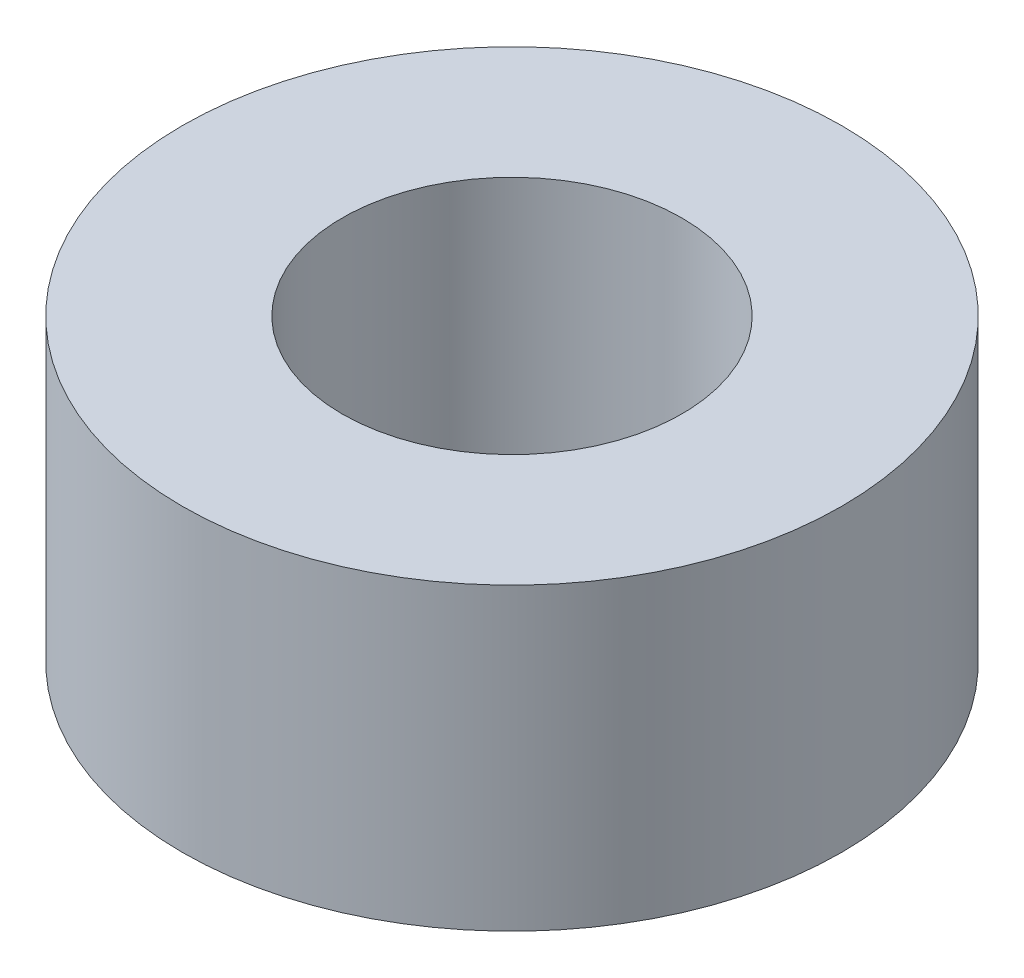
ISO-10303-21;
HEADER;
FILE_DESCRIPTION(('STEP AP214'),'2;1');
FILE_NAME('part.step','',(''),(''),'','','');
FILE_SCHEMA(('AUTOMOTIVE_DESIGN { 1 0 10303 214 1 1 1 1 }'));
ENDSEC;
DATA;
#1=APPLICATION_CONTEXT('core data for automotive mechanical design processes');
#2=APPLICATION_PROTOCOL_DEFINITION('international standard','automotive_design',2000,#1);
#3=PRODUCT_CONTEXT('',#1,'mechanical');
#4=PRODUCT('Part','Part','',(#3));
#5=PRODUCT_RELATED_PRODUCT_CATEGORY('part','',(#4));
#6=PRODUCT_DEFINITION_FORMATION('','',#4);
#7=PRODUCT_DEFINITION_CONTEXT('part definition',#1,'design');
#8=PRODUCT_DEFINITION('design','',#6,#7);
#9=PRODUCT_DEFINITION_SHAPE('','',#8);
#10=(LENGTH_UNIT() NAMED_UNIT(*) SI_UNIT(.MILLI.,.METRE.));
#11=(NAMED_UNIT(*) PLANE_ANGLE_UNIT() SI_UNIT($,.RADIAN.));
#12=(NAMED_UNIT(*) SI_UNIT($,.STERADIAN.) SOLID_ANGLE_UNIT());
#13=UNCERTAINTY_MEASURE_WITH_UNIT(LENGTH_MEASURE(1.E-05),#10,'distance_accuracy_value','');
#14=(GEOMETRIC_REPRESENTATION_CONTEXT(3) GLOBAL_UNCERTAINTY_ASSIGNED_CONTEXT((#13)) GLOBAL_UNIT_ASSIGNED_CONTEXT((#10,
#11,#12)) REPRESENTATION_CONTEXT('',''));
#15=CARTESIAN_POINT('',(0.,0.,0.));
#16=DIRECTION('',(0.,0.,1.));
#17=DIRECTION('',(1.,0.,0.));
#18=AXIS2_PLACEMENT_3D('',#15,#16,#17);
#19=CARTESIAN_POINT('',(0.,3.,0.));
#20=DIRECTION('',(0.,-1.,0.));
#21=DIRECTION('',(0.,0.,-1.));
#22=AXIS2_PLACEMENT_3D('',#19,#20,#21);
#23=CYLINDRICAL_SURFACE('',#22,3.3);
#24=CARTESIAN_POINT('',(0.,3.,0.));
#25=DIRECTION('',(0.,1.,0.));
#26=DIRECTION('',(0.,0.,1.));
#27=AXIS2_PLACEMENT_3D('',#24,#25,#26);
#28=CIRCLE('',#27,3.3);
#29=CARTESIAN_POINT('',(0.,3.,3.3));
#30=VERTEX_POINT('',#29);
#31=EDGE_CURVE('E10',#30,#30,#28,.T.);
#32=ORIENTED_EDGE('',*,*,#31,.F.);
#33=EDGE_LOOP('',(#32));
#34=FACE_BOUND('',#33,.T.);
#35=CARTESIAN_POINT('',(0.,0.,0.));
#36=DIRECTION('',(0.,1.,0.));
#37=DIRECTION('',(0.,0.,1.));
#38=AXIS2_PLACEMENT_3D('',#35,#36,#37);
#39=CIRCLE('',#38,3.3);
#40=CARTESIAN_POINT('',(0.,0.,3.3));
#41=VERTEX_POINT('',#40);
#42=EDGE_CURVE('E34',#41,#41,#39,.T.);
#43=ORIENTED_EDGE('',*,*,#42,.T.);
#44=EDGE_LOOP('',(#43));
#45=FACE_BOUND('',#44,.T.);
#46=ADVANCED_FACE('F31',(#34,#45),#23,.T.);
#47=CARTESIAN_POINT('',(0.,3.,0.));
#48=DIRECTION('',(0.,1.,0.));
#49=DIRECTION('',(0.,0.,1.));
#50=AXIS2_PLACEMENT_3D('',#47,#48,#49);
#51=PLANE('',#50);
#52=CARTESIAN_POINT('',(0.,3.,0.));
#53=DIRECTION('',(0.,1.,0.));
#54=DIRECTION('',(0.,0.,1.));
#55=AXIS2_PLACEMENT_3D('',#52,#53,#54);
#56=CIRCLE('',#55,1.69999999999999);
#57=CARTESIAN_POINT('',(0.,3.,1.69999999999999));
#58=VERTEX_POINT('',#57);
#59=EDGE_CURVE('E45',#58,#58,#56,.T.);
#60=ORIENTED_EDGE('',*,*,#59,.F.);
#61=EDGE_LOOP('',(#60));
#62=FACE_BOUND('',#61,.T.);
#63=ORIENTED_EDGE('',*,*,#31,.T.);
#64=EDGE_LOOP('',(#63));
#65=FACE_BOUND('',#64,.T.);
#66=ADVANCED_FACE('F51',(#62,#65),#51,.T.);
#67=CARTESIAN_POINT('',(0.,0.,0.));
#68=DIRECTION('',(0.,1.,0.));
#69=DIRECTION('',(0.,0.,1.));
#70=AXIS2_PLACEMENT_3D('',#67,#68,#69);
#71=PLANE('',#70);
#72=CARTESIAN_POINT('',(0.,0.,0.));
#73=DIRECTION('',(0.,1.,0.));
#74=DIRECTION('',(0.,0.,1.));
#75=AXIS2_PLACEMENT_3D('',#72,#73,#74);
#76=CIRCLE('',#75,1.7);
#77=CARTESIAN_POINT('',(0.,0.,1.7));
#78=VERTEX_POINT('',#77);
#79=EDGE_CURVE('E41',#78,#78,#76,.T.);
#80=ORIENTED_EDGE('',*,*,#79,.T.);
#81=EDGE_LOOP('',(#80));
#82=FACE_BOUND('',#81,.T.);
#83=ORIENTED_EDGE('',*,*,#42,.F.);
#84=EDGE_LOOP('',(#83));
#85=FACE_BOUND('',#84,.T.);
#86=ADVANCED_FACE('F53',(#82,#85),#71,.F.);
#87=CARTESIAN_POINT('',(0.,3.,0.));
#88=DIRECTION('',(0.,1.,0.));
#89=DIRECTION('',(0.,0.,1.));
#90=AXIS2_PLACEMENT_3D('',#87,#88,#89);
#91=CYLINDRICAL_SURFACE('',#90,1.69999999999999);
#92=ORIENTED_EDGE('',*,*,#79,.F.);
#93=EDGE_LOOP('',(#92));
#94=FACE_BOUND('',#93,.T.);
#95=ORIENTED_EDGE('',*,*,#59,.T.);
#96=EDGE_LOOP('',(#95));
#97=FACE_BOUND('',#96,.T.);
#98=ADVANCED_FACE('F49',(#94,#97),#91,.F.);
#99=CLOSED_SHELL('',(#46,#66,#86,#98));
#100=MANIFOLD_SOLID_BREP('B2',#99);
#101=ADVANCED_BREP_SHAPE_REPRESENTATION('',(#18,#100),#14);
#102=SHAPE_DEFINITION_REPRESENTATION(#9,#101);
ENDSEC;
END-ISO-10303-21;
